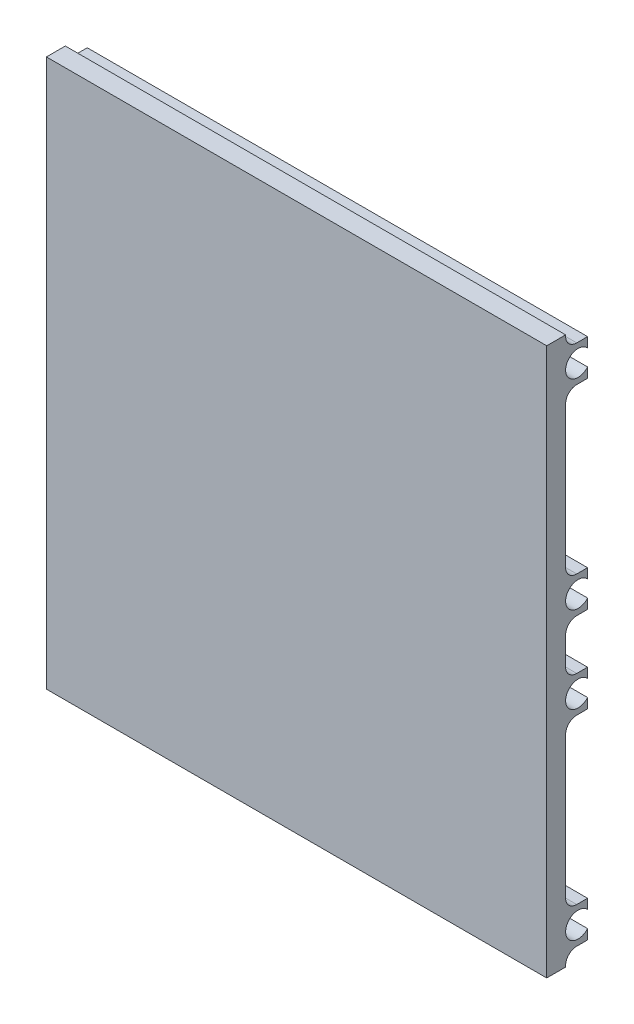
ISO-10303-21;
HEADER;
FILE_DESCRIPTION(('STEP AP214'),'2;1');
FILE_NAME('part.step','',(''),(''),'','','');
FILE_SCHEMA(('AUTOMOTIVE_DESIGN { 1 0 10303 214 1 1 1 1 }'));
ENDSEC;
DATA;
#1=APPLICATION_CONTEXT('core data for automotive mechanical design processes');
#2=APPLICATION_PROTOCOL_DEFINITION('international standard','automotive_design',2000,#1);
#3=PRODUCT_CONTEXT('',#1,'mechanical');
#4=PRODUCT('Part','Part','',(#3));
#5=PRODUCT_RELATED_PRODUCT_CATEGORY('part','',(#4));
#6=PRODUCT_DEFINITION_FORMATION('','',#4);
#7=PRODUCT_DEFINITION_CONTEXT('part definition',#1,'design');
#8=PRODUCT_DEFINITION('design','',#6,#7);
#9=PRODUCT_DEFINITION_SHAPE('','',#8);
#10=(LENGTH_UNIT() NAMED_UNIT(*) SI_UNIT(.MILLI.,.METRE.));
#11=(NAMED_UNIT(*) PLANE_ANGLE_UNIT() SI_UNIT($,.RADIAN.));
#12=(NAMED_UNIT(*) SI_UNIT($,.STERADIAN.) SOLID_ANGLE_UNIT());
#13=UNCERTAINTY_MEASURE_WITH_UNIT(LENGTH_MEASURE(1.E-05),#10,'distance_accuracy_value','');
#14=(GEOMETRIC_REPRESENTATION_CONTEXT(3) GLOBAL_UNCERTAINTY_ASSIGNED_CONTEXT((#13)) GLOBAL_UNIT_ASSIGNED_CONTEXT((#10,
#11,#12)) REPRESENTATION_CONTEXT('',''));
#15=CARTESIAN_POINT('',(0.,0.,0.));
#16=DIRECTION('',(0.,0.,1.));
#17=DIRECTION('',(1.,0.,0.));
#18=AXIS2_PLACEMENT_3D('',#15,#16,#17);
#19=CARTESIAN_POINT('',(90.,226.75,-13.));
#20=DIRECTION('',(1.,0.,0.));
#21=DIRECTION('',(0.,0.,-1.));
#22=AXIS2_PLACEMENT_3D('',#19,#20,#21);
#23=CYLINDRICAL_SURFACE('',#22,2.);
#24=DIRECTION('',(-1.,0.,0.));
#25=VECTOR('',#24,1.);
#26=CARTESIAN_POINT('',(90.,228.75,-13.));
#27=LINE('',#26,#25);
#28=CARTESIAN_POINT('',(90.,228.75,-13.));
#29=VERTEX_POINT('',#28);
#30=CARTESIAN_POINT('',(0.,228.75,-13.));
#31=VERTEX_POINT('',#30);
#32=EDGE_CURVE('E513',#29,#31,#27,.T.);
#33=ORIENTED_EDGE('',*,*,#32,.F.);
#34=CARTESIAN_POINT('',(90.,226.75,-13.));
#35=DIRECTION('',(1.,0.,0.));
#36=DIRECTION('',(0.,0.,-1.));
#37=AXIS2_PLACEMENT_3D('',#34,#35,#36);
#38=CIRCLE('',#37,2.);
#39=CARTESIAN_POINT('',(90.,226.75,-11.));
#40=VERTEX_POINT('',#39);
#41=EDGE_CURVE('E40',#29,#40,#38,.T.);
#42=ORIENTED_EDGE('',*,*,#41,.T.);
#43=DIRECTION('',(-1.,0.,0.));
#44=VECTOR('',#43,1.);
#45=CARTESIAN_POINT('',(90.,226.75,-11.));
#46=LINE('',#45,#44);
#47=CARTESIAN_POINT('',(0.,226.75,-11.));
#48=VERTEX_POINT('',#47);
#49=EDGE_CURVE('E516',#48,#40,#46,.F.);
#50=ORIENTED_EDGE('',*,*,#49,.F.);
#51=CARTESIAN_POINT('',(0.,226.75,-13.));
#52=DIRECTION('',(1.,0.,0.));
#53=DIRECTION('',(0.,0.,-1.));
#54=AXIS2_PLACEMENT_3D('',#51,#52,#53);
#55=CIRCLE('',#54,2.);
#56=EDGE_CURVE('E11',#48,#31,#55,.F.);
#57=ORIENTED_EDGE('',*,*,#56,.T.);
#58=EDGE_LOOP('',(#33,#42,#50,#57));
#59=FACE_BOUND('',#58,.T.);
#60=ADVANCED_FACE('F33',(#59),#23,.F.);
#61=CARTESIAN_POINT('',(90.,237.25,-13.));
#62=DIRECTION('',(-1.,0.,0.));
#63=DIRECTION('',(0.,0.,1.));
#64=AXIS2_PLACEMENT_3D('',#61,#62,#63);
#65=CYLINDRICAL_SURFACE('',#64,2.);
#66=DIRECTION('',(1.,0.,0.));
#67=VECTOR('',#66,1.);
#68=CARTESIAN_POINT('',(90.,235.25,-13.));
#69=LINE('',#68,#67);
#70=CARTESIAN_POINT('',(0.,235.25,-13.));
#71=VERTEX_POINT('',#70);
#72=CARTESIAN_POINT('',(90.,235.25,-13.));
#73=VERTEX_POINT('',#72);
#74=EDGE_CURVE('E503',#71,#73,#69,.T.);
#75=ORIENTED_EDGE('',*,*,#74,.F.);
#76=CARTESIAN_POINT('',(0.,237.25,-13.));
#77=DIRECTION('',(1.,0.,0.));
#78=DIRECTION('',(0.,0.,-1.));
#79=AXIS2_PLACEMENT_3D('',#76,#77,#78);
#80=CIRCLE('',#79,2.);
#81=CARTESIAN_POINT('',(0.,237.25,-11.));
#82=VERTEX_POINT('',#81);
#83=EDGE_CURVE('E509',#71,#82,#80,.F.);
#84=ORIENTED_EDGE('',*,*,#83,.T.);
#85=DIRECTION('',(1.,0.,0.));
#86=VECTOR('',#85,1.);
#87=CARTESIAN_POINT('',(90.,237.25,-11.));
#88=LINE('',#87,#86);
#89=CARTESIAN_POINT('',(90.,237.25,-11.));
#90=VERTEX_POINT('',#89);
#91=EDGE_CURVE('E506',#90,#82,#88,.F.);
#92=ORIENTED_EDGE('',*,*,#91,.F.);
#93=CARTESIAN_POINT('',(90.,237.25,-13.));
#94=DIRECTION('',(1.,0.,0.));
#95=DIRECTION('',(0.,0.,-1.));
#96=AXIS2_PLACEMENT_3D('',#93,#94,#95);
#97=CIRCLE('',#96,2.);
#98=EDGE_CURVE('E511',#90,#73,#97,.T.);
#99=ORIENTED_EDGE('',*,*,#98,.T.);
#100=EDGE_LOOP('',(#75,#84,#92,#99));
#101=FACE_BOUND('',#100,.T.);
#102=ADVANCED_FACE('F615',(#101),#65,.F.);
#103=CARTESIAN_POINT('',(90.,262.75,-13.));
#104=DIRECTION('',(1.,0.,0.));
#105=DIRECTION('',(0.,0.,-1.));
#106=AXIS2_PLACEMENT_3D('',#103,#104,#105);
#107=CYLINDRICAL_SURFACE('',#106,2.);
#108=DIRECTION('',(-1.,0.,0.));
#109=VECTOR('',#108,1.);
#110=CARTESIAN_POINT('',(90.,264.75,-13.));
#111=LINE('',#110,#109);
#112=CARTESIAN_POINT('',(90.,264.75,-13.));
#113=VERTEX_POINT('',#112);
#114=CARTESIAN_POINT('',(0.,264.75,-13.));
#115=VERTEX_POINT('',#114);
#116=EDGE_CURVE('E492',#113,#115,#111,.T.);
#117=ORIENTED_EDGE('',*,*,#116,.F.);
#118=CARTESIAN_POINT('',(90.,262.75,-13.));
#119=DIRECTION('',(1.,0.,0.));
#120=DIRECTION('',(0.,0.,-1.));
#121=AXIS2_PLACEMENT_3D('',#118,#119,#120);
#122=CIRCLE('',#121,2.);
#123=CARTESIAN_POINT('',(90.,262.75,-11.));
#124=VERTEX_POINT('',#123);
#125=EDGE_CURVE('E498',#113,#124,#122,.T.);
#126=ORIENTED_EDGE('',*,*,#125,.T.);
#127=DIRECTION('',(-1.,0.,0.));
#128=VECTOR('',#127,1.);
#129=CARTESIAN_POINT('',(90.,262.75,-11.));
#130=LINE('',#129,#128);
#131=CARTESIAN_POINT('',(0.,262.75,-11.));
#132=VERTEX_POINT('',#131);
#133=EDGE_CURVE('E495',#132,#124,#130,.F.);
#134=ORIENTED_EDGE('',*,*,#133,.F.);
#135=CARTESIAN_POINT('',(0.,262.75,-13.));
#136=DIRECTION('',(1.,0.,0.));
#137=DIRECTION('',(0.,0.,-1.));
#138=AXIS2_PLACEMENT_3D('',#135,#136,#137);
#139=CIRCLE('',#138,2.);
#140=EDGE_CURVE('E501',#132,#115,#139,.F.);
#141=ORIENTED_EDGE('',*,*,#140,.T.);
#142=EDGE_LOOP('',(#117,#126,#134,#141));
#143=FACE_BOUND('',#142,.T.);
#144=ADVANCED_FACE('F606',(#143),#107,.F.);
#145=CARTESIAN_POINT('',(90.,273.25,-13.));
#146=DIRECTION('',(1.,0.,0.));
#147=DIRECTION('',(0.,0.,-1.));
#148=AXIS2_PLACEMENT_3D('',#145,#146,#147);
#149=CYLINDRICAL_SURFACE('',#148,2.);
#150=DIRECTION('',(-1.,0.,0.));
#151=VECTOR('',#150,1.);
#152=CARTESIAN_POINT('',(90.,273.25,-11.));
#153=LINE('',#152,#151);
#154=CARTESIAN_POINT('',(90.,273.25,-11.));
#155=VERTEX_POINT('',#154);
#156=CARTESIAN_POINT('',(0.,273.25,-11.));
#157=VERTEX_POINT('',#156);
#158=EDGE_CURVE('E482',#155,#157,#153,.T.);
#159=ORIENTED_EDGE('',*,*,#158,.F.);
#160=CARTESIAN_POINT('',(90.,273.25,-13.));
#161=DIRECTION('',(1.,0.,0.));
#162=DIRECTION('',(0.,0.,-1.));
#163=AXIS2_PLACEMENT_3D('',#160,#161,#162);
#164=CIRCLE('',#163,2.);
#165=CARTESIAN_POINT('',(90.,271.25,-13.));
#166=VERTEX_POINT('',#165);
#167=EDGE_CURVE('E488',#155,#166,#164,.T.);
#168=ORIENTED_EDGE('',*,*,#167,.T.);
#169=DIRECTION('',(-1.,0.,0.));
#170=VECTOR('',#169,1.);
#171=CARTESIAN_POINT('',(90.,271.25,-13.));
#172=LINE('',#171,#170);
#173=CARTESIAN_POINT('',(0.,271.25,-13.));
#174=VERTEX_POINT('',#173);
#175=EDGE_CURVE('E485',#174,#166,#172,.F.);
#176=ORIENTED_EDGE('',*,*,#175,.F.);
#177=CARTESIAN_POINT('',(0.,273.25,-13.));
#178=DIRECTION('',(1.,0.,0.));
#179=DIRECTION('',(0.,0.,-1.));
#180=AXIS2_PLACEMENT_3D('',#177,#178,#179);
#181=CIRCLE('',#180,2.);
#182=EDGE_CURVE('E490',#174,#157,#181,.F.);
#183=ORIENTED_EDGE('',*,*,#182,.T.);
#184=EDGE_LOOP('',(#159,#168,#176,#183));
#185=FACE_BOUND('',#184,.T.);
#186=ADVANCED_FACE('F600',(#185),#149,.F.);
#187=CARTESIAN_POINT('',(90.,278.25,-13.));
#188=DIRECTION('',(-1.,0.,0.));
#189=DIRECTION('',(0.,0.,1.));
#190=AXIS2_PLACEMENT_3D('',#187,#188,#189);
#191=CYLINDRICAL_SURFACE('',#190,2.);
#192=DIRECTION('',(1.,0.,0.));
#193=VECTOR('',#192,1.);
#194=CARTESIAN_POINT('',(90.,278.25,-11.));
#195=LINE('',#194,#193);
#196=CARTESIAN_POINT('',(0.,278.25,-11.));
#197=VERTEX_POINT('',#196);
#198=CARTESIAN_POINT('',(90.,278.25,-11.));
#199=VERTEX_POINT('',#198);
#200=EDGE_CURVE('E471',#197,#199,#195,.T.);
#201=ORIENTED_EDGE('',*,*,#200,.F.);
#202=CARTESIAN_POINT('',(0.,278.25,-13.));
#203=DIRECTION('',(1.,0.,0.));
#204=DIRECTION('',(0.,0.,-1.));
#205=AXIS2_PLACEMENT_3D('',#202,#203,#204);
#206=CIRCLE('',#205,2.);
#207=CARTESIAN_POINT('',(0.,280.25,-13.));
#208=VERTEX_POINT('',#207);
#209=EDGE_CURVE('E477',#197,#208,#206,.F.);
#210=ORIENTED_EDGE('',*,*,#209,.T.);
#211=DIRECTION('',(1.,0.,0.));
#212=VECTOR('',#211,1.);
#213=CARTESIAN_POINT('',(90.,280.25,-13.));
#214=LINE('',#213,#212);
#215=CARTESIAN_POINT('',(90.,280.25,-13.));
#216=VERTEX_POINT('',#215);
#217=EDGE_CURVE('E474',#216,#208,#214,.F.);
#218=ORIENTED_EDGE('',*,*,#217,.F.);
#219=CARTESIAN_POINT('',(90.,278.25,-13.));
#220=DIRECTION('',(1.,0.,0.));
#221=DIRECTION('',(0.,0.,-1.));
#222=AXIS2_PLACEMENT_3D('',#219,#220,#221);
#223=CIRCLE('',#222,2.);
#224=EDGE_CURVE('E479',#216,#199,#223,.T.);
#225=ORIENTED_EDGE('',*,*,#224,.T.);
#226=EDGE_LOOP('',(#201,#210,#218,#225));
#227=FACE_BOUND('',#226,.T.);
#228=ADVANCED_FACE('F641',(#227),#191,.F.);
#229=CARTESIAN_POINT('',(90.,288.75,-13.));
#230=DIRECTION('',(1.,0.,0.));
#231=DIRECTION('',(0.,0.,-1.));
#232=AXIS2_PLACEMENT_3D('',#229,#230,#231);
#233=CYLINDRICAL_SURFACE('',#232,2.);
#234=DIRECTION('',(-1.,0.,0.));
#235=VECTOR('',#234,1.);
#236=CARTESIAN_POINT('',(90.,288.75,-11.));
#237=LINE('',#236,#235);
#238=CARTESIAN_POINT('',(90.,288.75,-11.));
#239=VERTEX_POINT('',#238);
#240=CARTESIAN_POINT('',(0.,288.75,-11.));
#241=VERTEX_POINT('',#240);
#242=EDGE_CURVE('E461',#239,#241,#237,.T.);
#243=ORIENTED_EDGE('',*,*,#242,.F.);
#244=CARTESIAN_POINT('',(90.,288.75,-13.));
#245=DIRECTION('',(1.,0.,0.));
#246=DIRECTION('',(0.,0.,-1.));
#247=AXIS2_PLACEMENT_3D('',#244,#245,#246);
#248=CIRCLE('',#247,2.);
#249=CARTESIAN_POINT('',(90.,286.75,-13.));
#250=VERTEX_POINT('',#249);
#251=EDGE_CURVE('E467',#239,#250,#248,.T.);
#252=ORIENTED_EDGE('',*,*,#251,.T.);
#253=DIRECTION('',(-1.,0.,0.));
#254=VECTOR('',#253,1.);
#255=CARTESIAN_POINT('',(90.,286.75,-13.));
#256=LINE('',#255,#254);
#257=CARTESIAN_POINT('',(0.,286.75,-13.));
#258=VERTEX_POINT('',#257);
#259=EDGE_CURVE('E464',#258,#250,#256,.F.);
#260=ORIENTED_EDGE('',*,*,#259,.F.);
#261=CARTESIAN_POINT('',(0.,288.75,-13.));
#262=DIRECTION('',(1.,0.,0.));
#263=DIRECTION('',(0.,0.,-1.));
#264=AXIS2_PLACEMENT_3D('',#261,#262,#263);
#265=CIRCLE('',#264,2.);
#266=EDGE_CURVE('E469',#258,#241,#265,.F.);
#267=ORIENTED_EDGE('',*,*,#266,.T.);
#268=EDGE_LOOP('',(#243,#252,#260,#267));
#269=FACE_BOUND('',#268,.T.);
#270=ADVANCED_FACE('F644',(#269),#233,.F.);
#271=CARTESIAN_POINT('',(90.,314.25,-13.));
#272=DIRECTION('',(1.,0.,0.));
#273=DIRECTION('',(0.,0.,-1.));
#274=AXIS2_PLACEMENT_3D('',#271,#272,#273);
#275=CYLINDRICAL_SURFACE('',#274,2.);
#276=DIRECTION('',(-1.,0.,0.));
#277=VECTOR('',#276,1.);
#278=CARTESIAN_POINT('',(90.,316.25,-13.));
#279=LINE('',#278,#277);
#280=CARTESIAN_POINT('',(90.,316.25,-13.));
#281=VERTEX_POINT('',#280);
#282=CARTESIAN_POINT('',(0.,316.25,-13.));
#283=VERTEX_POINT('',#282);
#284=EDGE_CURVE('E450',#281,#283,#279,.T.);
#285=ORIENTED_EDGE('',*,*,#284,.F.);
#286=CARTESIAN_POINT('',(90.,314.25,-13.));
#287=DIRECTION('',(1.,0.,0.));
#288=DIRECTION('',(0.,0.,-1.));
#289=AXIS2_PLACEMENT_3D('',#286,#287,#288);
#290=CIRCLE('',#289,2.);
#291=CARTESIAN_POINT('',(90.,314.25,-11.));
#292=VERTEX_POINT('',#291);
#293=EDGE_CURVE('E456',#281,#292,#290,.T.);
#294=ORIENTED_EDGE('',*,*,#293,.T.);
#295=DIRECTION('',(-1.,0.,0.));
#296=VECTOR('',#295,1.);
#297=CARTESIAN_POINT('',(90.,314.25,-11.));
#298=LINE('',#297,#296);
#299=CARTESIAN_POINT('',(0.,314.25,-11.));
#300=VERTEX_POINT('',#299);
#301=EDGE_CURVE('E453',#300,#292,#298,.F.);
#302=ORIENTED_EDGE('',*,*,#301,.F.);
#303=CARTESIAN_POINT('',(0.,314.25,-13.));
#304=DIRECTION('',(1.,0.,0.));
#305=DIRECTION('',(0.,0.,-1.));
#306=AXIS2_PLACEMENT_3D('',#303,#304,#305);
#307=CIRCLE('',#306,2.);
#308=EDGE_CURVE('E459',#300,#283,#307,.F.);
#309=ORIENTED_EDGE('',*,*,#308,.T.);
#310=EDGE_LOOP('',(#285,#294,#302,#309));
#311=FACE_BOUND('',#310,.T.);
#312=ADVANCED_FACE('F648',(#311),#275,.F.);
#313=CARTESIAN_POINT('',(90.,324.75,-13.));
#314=DIRECTION('',(1.,0.,0.));
#315=DIRECTION('',(0.,0.,-1.));
#316=AXIS2_PLACEMENT_3D('',#313,#314,#315);
#317=CYLINDRICAL_SURFACE('',#316,2.);
#318=DIRECTION('',(-1.,0.,0.));
#319=VECTOR('',#318,1.);
#320=CARTESIAN_POINT('',(90.,324.75,-11.));
#321=LINE('',#320,#319);
#322=CARTESIAN_POINT('',(90.,324.75,-11.));
#323=VERTEX_POINT('',#322);
#324=CARTESIAN_POINT('',(0.,324.75,-11.));
#325=VERTEX_POINT('',#324);
#326=EDGE_CURVE('E440',#323,#325,#321,.T.);
#327=ORIENTED_EDGE('',*,*,#326,.F.);
#328=CARTESIAN_POINT('',(90.,324.75,-13.));
#329=DIRECTION('',(1.,0.,0.));
#330=DIRECTION('',(0.,0.,-1.));
#331=AXIS2_PLACEMENT_3D('',#328,#329,#330);
#332=CIRCLE('',#331,2.);
#333=CARTESIAN_POINT('',(90.,322.75,-13.));
#334=VERTEX_POINT('',#333);
#335=EDGE_CURVE('E446',#323,#334,#332,.T.);
#336=ORIENTED_EDGE('',*,*,#335,.T.);
#337=DIRECTION('',(-1.,0.,0.));
#338=VECTOR('',#337,1.);
#339=CARTESIAN_POINT('',(90.,322.75,-13.));
#340=LINE('',#339,#338);
#341=CARTESIAN_POINT('',(0.,322.75,-13.));
#342=VERTEX_POINT('',#341);
#343=EDGE_CURVE('E443',#342,#334,#340,.F.);
#344=ORIENTED_EDGE('',*,*,#343,.F.);
#345=CARTESIAN_POINT('',(0.,324.75,-13.));
#346=DIRECTION('',(1.,0.,0.));
#347=DIRECTION('',(0.,0.,-1.));
#348=AXIS2_PLACEMENT_3D('',#345,#346,#347);
#349=CIRCLE('',#348,2.);
#350=EDGE_CURVE('E448',#342,#325,#349,.F.);
#351=ORIENTED_EDGE('',*,*,#350,.T.);
#352=EDGE_LOOP('',(#327,#336,#344,#351));
#353=FACE_BOUND('',#352,.T.);
#354=ADVANCED_FACE('F652',(#353),#317,.F.);
#355=CARTESIAN_POINT('',(90.,224.250000000007,-5.50000000000004));
#356=DIRECTION('',(1.,0.,0.));
#357=DIRECTION('',(0.,0.,-1.));
#358=AXIS2_PLACEMENT_3D('',#355,#356,#357);
#359=PLANE('',#358);
#360=DIRECTION('',(0.,0.,1.));
#361=VECTOR('',#360,1.);
#362=CARTESIAN_POINT('',(90.,325.,-11.));
#363=LINE('',#362,#361);
#364=CARTESIAN_POINT('',(90.,325.,-11.));
#365=VERTEX_POINT('',#364);
#366=CARTESIAN_POINT('',(90.,325.,-7.6));
#367=VERTEX_POINT('',#366);
#368=EDGE_CURVE('E280',#365,#367,#363,.T.);
#369=ORIENTED_EDGE('',*,*,#368,.T.);
#370=DIRECTION('',(0.,1.,0.));
#371=VECTOR('',#370,1.);
#372=CARTESIAN_POINT('',(90.,226.5,-7.6));
#373=LINE('',#372,#371);
#374=CARTESIAN_POINT('',(90.,226.5,-7.6));
#375=VERTEX_POINT('',#374);
#376=EDGE_CURVE('E277',#375,#367,#373,.T.);
#377=ORIENTED_EDGE('',*,*,#376,.F.);
#378=DIRECTION('',(0.,0.,1.));
#379=VECTOR('',#378,1.);
#380=CARTESIAN_POINT('',(90.,226.5,-14.9500000000008));
#381=LINE('',#380,#379);
#382=CARTESIAN_POINT('',(90.,226.5,-11.));
#383=VERTEX_POINT('',#382);
#384=EDGE_CURVE('E264',#383,#375,#381,.T.);
#385=ORIENTED_EDGE('',*,*,#384,.F.);
#386=DIRECTION('',(0.,1.,0.));
#387=VECTOR('',#386,1.);
#388=CARTESIAN_POINT('',(90.,226.5,-11.));
#389=LINE('',#388,#387);
#390=EDGE_CURVE('E413',#383,#40,#389,.T.);
#391=ORIENTED_EDGE('',*,*,#390,.T.);
#392=ORIENTED_EDGE('',*,*,#41,.F.);
#393=DIRECTION('',(0.,0.,-1.));
#394=VECTOR('',#393,1.);
#395=CARTESIAN_POINT('',(90.,228.75,-11.));
#396=LINE('',#395,#394);
#397=CARTESIAN_POINT('',(90.,228.75,-14.95));
#398=VERTEX_POINT('',#397);
#399=EDGE_CURVE('E415',#29,#398,#396,.T.);
#400=ORIENTED_EDGE('',*,*,#399,.T.);
#401=DIRECTION('',(0.,-1.,0.));
#402=VECTOR('',#401,1.);
#403=CARTESIAN_POINT('',(90.,226.5,-14.9500000000008));
#404=LINE('',#403,#402);
#405=CARTESIAN_POINT('',(90.,230.526059702703,-14.9500000000008));
#406=VERTEX_POINT('',#405);
#407=EDGE_CURVE('E429',#406,#398,#404,.T.);
#408=ORIENTED_EDGE('',*,*,#407,.F.);
#409=CARTESIAN_POINT('',(90.,232.,-13.25));
#410=DIRECTION('',(1.,0.,0.));
#411=DIRECTION('',(0.,0.,-1.));
#412=AXIS2_PLACEMENT_3D('',#409,#410,#411);
#413=CIRCLE('',#412,2.24999999999997);
#414=CARTESIAN_POINT('',(90.,233.473940297297,-14.9500000000008));
#415=VERTEX_POINT('',#414);
#416=EDGE_CURVE('E438',#415,#406,#413,.T.);
#417=ORIENTED_EDGE('',*,*,#416,.F.);
#418=CARTESIAN_POINT('',(90.,235.25,-14.9500000000008));
#419=VERTEX_POINT('',#418);
#420=EDGE_CURVE('E434',#419,#415,#404,.T.);
#421=ORIENTED_EDGE('',*,*,#420,.F.);
#422=DIRECTION('',(0.,0.,1.));
#423=VECTOR('',#422,1.);
#424=CARTESIAN_POINT('',(90.,235.25,-14.95));
#425=LINE('',#424,#423);
#426=EDGE_CURVE('E393',#419,#73,#425,.T.);
#427=ORIENTED_EDGE('',*,*,#426,.T.);
#428=ORIENTED_EDGE('',*,*,#98,.F.);
#429=DIRECTION('',(0.,1.,0.));
#430=VECTOR('',#429,1.);
#431=CARTESIAN_POINT('',(90.,235.25,-11.));
#432=LINE('',#431,#430);
#433=EDGE_CURVE('E396',#90,#124,#432,.T.);
#434=ORIENTED_EDGE('',*,*,#433,.T.);
#435=ORIENTED_EDGE('',*,*,#125,.F.);
#436=DIRECTION('',(0.,0.,-1.));
#437=VECTOR('',#436,1.);
#438=CARTESIAN_POINT('',(90.,264.75,-11.));
#439=LINE('',#438,#437);
#440=CARTESIAN_POINT('',(90.,264.75,-14.95));
#441=VERTEX_POINT('',#440);
#442=EDGE_CURVE('E399',#113,#441,#439,.T.);
#443=ORIENTED_EDGE('',*,*,#442,.T.);
#444=CARTESIAN_POINT('',(90.,266.526059702703,-14.9500000000009));
#445=VERTEX_POINT('',#444);
#446=EDGE_CURVE('E540',#445,#441,#404,.T.);
#447=ORIENTED_EDGE('',*,*,#446,.F.);
#448=CARTESIAN_POINT('',(90.,268.,-13.25));
#449=DIRECTION('',(1.,0.,0.));
#450=DIRECTION('',(0.,0.,-1.));
#451=AXIS2_PLACEMENT_3D('',#448,#449,#450);
#452=CIRCLE('',#451,2.24999999999997);
#453=CARTESIAN_POINT('',(90.,269.473940297297,-14.9500000000009));
#454=VERTEX_POINT('',#453);
#455=EDGE_CURVE('E305',#454,#445,#452,.T.);
#456=ORIENTED_EDGE('',*,*,#455,.F.);
#457=CARTESIAN_POINT('',(90.,271.25,-14.95));
#458=VERTEX_POINT('',#457);
#459=EDGE_CURVE('E541',#458,#454,#404,.T.);
#460=ORIENTED_EDGE('',*,*,#459,.F.);
#461=DIRECTION('',(0.,0.,1.));
#462=VECTOR('',#461,1.);
#463=CARTESIAN_POINT('',(90.,271.25,-14.95));
#464=LINE('',#463,#462);
#465=EDGE_CURVE('E373',#458,#166,#464,.T.);
#466=ORIENTED_EDGE('',*,*,#465,.T.);
#467=ORIENTED_EDGE('',*,*,#167,.F.);
#468=DIRECTION('',(0.,1.,0.));
#469=VECTOR('',#468,1.);
#470=CARTESIAN_POINT('',(90.,271.25,-11.));
#471=LINE('',#470,#469);
#472=EDGE_CURVE('E376',#155,#199,#471,.T.);
#473=ORIENTED_EDGE('',*,*,#472,.T.);
#474=ORIENTED_EDGE('',*,*,#224,.F.);
#475=DIRECTION('',(0.,0.,-1.));
#476=VECTOR('',#475,1.);
#477=CARTESIAN_POINT('',(90.,280.25,-11.));
#478=LINE('',#477,#476);
#479=CARTESIAN_POINT('',(90.,280.25,-14.95));
#480=VERTEX_POINT('',#479);
#481=EDGE_CURVE('E379',#216,#480,#478,.T.);
#482=ORIENTED_EDGE('',*,*,#481,.T.);
#483=CARTESIAN_POINT('',(90.,282.026059702703,-14.9500000000009));
#484=VERTEX_POINT('',#483);
#485=EDGE_CURVE('E543',#484,#480,#404,.T.);
#486=ORIENTED_EDGE('',*,*,#485,.F.);
#487=CARTESIAN_POINT('',(90.,283.5,-13.25));
#488=DIRECTION('',(-1.,0.,0.));
#489=DIRECTION('',(0.,0.,1.));
#490=AXIS2_PLACEMENT_3D('',#487,#488,#489);
#491=CIRCLE('',#490,2.24999999999997);
#492=CARTESIAN_POINT('',(90.,284.973940297297,-14.9500000000009));
#493=VERTEX_POINT('',#492);
#494=EDGE_CURVE('E312',#484,#493,#491,.T.);
#495=ORIENTED_EDGE('',*,*,#494,.T.);
#496=CARTESIAN_POINT('',(90.,286.75,-14.95));
#497=VERTEX_POINT('',#496);
#498=EDGE_CURVE('E545',#497,#493,#404,.T.);
#499=ORIENTED_EDGE('',*,*,#498,.F.);
#500=DIRECTION('',(0.,0.,1.));
#501=VECTOR('',#500,1.);
#502=CARTESIAN_POINT('',(90.,286.75,-14.95));
#503=LINE('',#502,#501);
#504=EDGE_CURVE('E353',#497,#250,#503,.T.);
#505=ORIENTED_EDGE('',*,*,#504,.T.);
#506=ORIENTED_EDGE('',*,*,#251,.F.);
#507=DIRECTION('',(0.,1.,0.));
#508=VECTOR('',#507,1.);
#509=CARTESIAN_POINT('',(90.,286.75,-11.));
#510=LINE('',#509,#508);
#511=EDGE_CURVE('E356',#239,#292,#510,.T.);
#512=ORIENTED_EDGE('',*,*,#511,.T.);
#513=ORIENTED_EDGE('',*,*,#293,.F.);
#514=DIRECTION('',(0.,0.,-1.));
#515=VECTOR('',#514,1.);
#516=CARTESIAN_POINT('',(90.,316.25,-11.));
#517=LINE('',#516,#515);
#518=CARTESIAN_POINT('',(90.,316.25,-14.95));
#519=VERTEX_POINT('',#518);
#520=EDGE_CURVE('E359',#281,#519,#517,.T.);
#521=ORIENTED_EDGE('',*,*,#520,.T.);
#522=CARTESIAN_POINT('',(90.,318.026059702703,-14.950000000001));
#523=VERTEX_POINT('',#522);
#524=EDGE_CURVE('E433',#523,#519,#404,.T.);
#525=ORIENTED_EDGE('',*,*,#524,.F.);
#526=CARTESIAN_POINT('',(90.,319.5,-13.25));
#527=DIRECTION('',(-1.,0.,0.));
#528=DIRECTION('',(0.,0.,1.));
#529=AXIS2_PLACEMENT_3D('',#526,#527,#528);
#530=CIRCLE('',#529,2.24999999999997);
#531=CARTESIAN_POINT('',(90.,320.973940297297,-14.950000000001));
#532=VERTEX_POINT('',#531);
#533=EDGE_CURVE('E323',#523,#532,#530,.T.);
#534=ORIENTED_EDGE('',*,*,#533,.T.);
#535=CARTESIAN_POINT('',(90.,322.75,-14.95));
#536=VERTEX_POINT('',#535);
#537=EDGE_CURVE('E274',#536,#532,#404,.T.);
#538=ORIENTED_EDGE('',*,*,#537,.F.);
#539=DIRECTION('',(0.,0.,1.));
#540=VECTOR('',#539,1.);
#541=CARTESIAN_POINT('',(90.,322.75,-14.95));
#542=LINE('',#541,#540);
#543=EDGE_CURVE('E340',#536,#334,#542,.T.);
#544=ORIENTED_EDGE('',*,*,#543,.T.);
#545=ORIENTED_EDGE('',*,*,#335,.F.);
#546=DIRECTION('',(0.,1.,0.));
#547=VECTOR('',#546,1.);
#548=CARTESIAN_POINT('',(90.,322.75,-11.));
#549=LINE('',#548,#547);
#550=EDGE_CURVE('E343',#323,#365,#549,.T.);
#551=ORIENTED_EDGE('',*,*,#550,.T.);
#552=EDGE_LOOP('',(#369,#377,#385,#391,#392,#400,#408,#417,#421,#427,#428,#434,#435,#443,#447,
#456,#460,#466,#467,#473,#474,#482,#486,#495,#499,#505,#506,#512,#513,#521,#525,#534,#538,#544,
#545,#551));
#553=FACE_BOUND('',#552,.T.);
#554=ADVANCED_FACE('F278',(#553),#359,.T.);
#555=CARTESIAN_POINT('',(0.,224.250000000007,-5.50000000000004));
#556=DIRECTION('',(1.,0.,0.));
#557=DIRECTION('',(0.,0.,-1.));
#558=AXIS2_PLACEMENT_3D('',#555,#556,#557);
#559=PLANE('',#558);
#560=DIRECTION('',(0.,0.,1.));
#561=VECTOR('',#560,1.);
#562=CARTESIAN_POINT('',(0.,226.5,-14.9500000000008));
#563=LINE('',#562,#561);
#564=CARTESIAN_POINT('',(0.,226.5,-11.));
#565=VERTEX_POINT('',#564);
#566=CARTESIAN_POINT('',(0.,226.5,-7.6));
#567=VERTEX_POINT('',#566);
#568=EDGE_CURVE('E273',#565,#567,#563,.T.);
#569=ORIENTED_EDGE('',*,*,#568,.T.);
#570=DIRECTION('',(0.,-1.,0.));
#571=VECTOR('',#570,1.);
#572=CARTESIAN_POINT('',(0.,325.,-7.6));
#573=LINE('',#572,#571);
#574=CARTESIAN_POINT('',(0.,325.,-7.6));
#575=VERTEX_POINT('',#574);
#576=EDGE_CURVE('E289',#575,#567,#573,.T.);
#577=ORIENTED_EDGE('',*,*,#576,.F.);
#578=DIRECTION('',(0.,0.,1.));
#579=VECTOR('',#578,1.);
#580=CARTESIAN_POINT('',(0.,325.,-11.));
#581=LINE('',#580,#579);
#582=CARTESIAN_POINT('',(0.,325.,-11.));
#583=VERTEX_POINT('',#582);
#584=EDGE_CURVE('E333',#583,#575,#581,.T.);
#585=ORIENTED_EDGE('',*,*,#584,.F.);
#586=DIRECTION('',(0.,1.,0.));
#587=VECTOR('',#586,1.);
#588=CARTESIAN_POINT('',(0.,322.75,-11.));
#589=LINE('',#588,#587);
#590=EDGE_CURVE('E344',#325,#583,#589,.T.);
#591=ORIENTED_EDGE('',*,*,#590,.F.);
#592=ORIENTED_EDGE('',*,*,#350,.F.);
#593=DIRECTION('',(0.,0.,1.));
#594=VECTOR('',#593,1.);
#595=CARTESIAN_POINT('',(0.,322.75,-14.95));
#596=LINE('',#595,#594);
#597=CARTESIAN_POINT('',(0.,322.75,-14.95));
#598=VERTEX_POINT('',#597);
#599=EDGE_CURVE('E339',#598,#342,#596,.T.);
#600=ORIENTED_EDGE('',*,*,#599,.F.);
#601=DIRECTION('',(0.,1.,0.));
#602=VECTOR('',#601,1.);
#603=CARTESIAN_POINT('',(0.,328.950000000002,-14.9500000000011));
#604=LINE('',#603,#602);
#605=CARTESIAN_POINT('',(0.,320.973940297297,-14.950000000001));
#606=VERTEX_POINT('',#605);
#607=EDGE_CURVE('E424',#606,#598,#604,.T.);
#608=ORIENTED_EDGE('',*,*,#607,.F.);
#609=CARTESIAN_POINT('',(0.,319.5,-13.25));
#610=DIRECTION('',(-1.,0.,0.));
#611=DIRECTION('',(0.,0.,1.));
#612=AXIS2_PLACEMENT_3D('',#609,#610,#611);
#613=CIRCLE('',#612,2.24999999999997);
#614=CARTESIAN_POINT('',(0.,318.026059702703,-14.950000000001));
#615=VERTEX_POINT('',#614);
#616=EDGE_CURVE('E314',#615,#606,#613,.T.);
#617=ORIENTED_EDGE('',*,*,#616,.F.);
#618=CARTESIAN_POINT('',(0.,316.25,-14.95));
#619=VERTEX_POINT('',#618);
#620=EDGE_CURVE('E570',#619,#615,#604,.T.);
#621=ORIENTED_EDGE('',*,*,#620,.F.);
#622=DIRECTION('',(0.,0.,-1.));
#623=VECTOR('',#622,1.);
#624=CARTESIAN_POINT('',(0.,316.25,-11.));
#625=LINE('',#624,#623);
#626=EDGE_CURVE('E357',#283,#619,#625,.T.);
#627=ORIENTED_EDGE('',*,*,#626,.F.);
#628=ORIENTED_EDGE('',*,*,#308,.F.);
#629=DIRECTION('',(0.,1.,0.));
#630=VECTOR('',#629,1.);
#631=CARTESIAN_POINT('',(0.,286.75,-11.));
#632=LINE('',#631,#630);
#633=EDGE_CURVE('E364',#241,#300,#632,.T.);
#634=ORIENTED_EDGE('',*,*,#633,.F.);
#635=ORIENTED_EDGE('',*,*,#266,.F.);
#636=DIRECTION('',(0.,0.,1.));
#637=VECTOR('',#636,1.);
#638=CARTESIAN_POINT('',(0.,286.75,-14.95));
#639=LINE('',#638,#637);
#640=CARTESIAN_POINT('',(0.,286.75,-14.95));
#641=VERTEX_POINT('',#640);
#642=EDGE_CURVE('E352',#641,#258,#639,.T.);
#643=ORIENTED_EDGE('',*,*,#642,.F.);
#644=CARTESIAN_POINT('',(0.,284.973940297297,-14.9500000000009));
#645=VERTEX_POINT('',#644);
#646=EDGE_CURVE('E572',#645,#641,#604,.T.);
#647=ORIENTED_EDGE('',*,*,#646,.F.);
#648=CARTESIAN_POINT('',(0.,283.5,-13.25));
#649=DIRECTION('',(-1.,0.,0.));
#650=DIRECTION('',(0.,0.,1.));
#651=AXIS2_PLACEMENT_3D('',#648,#649,#650);
#652=CIRCLE('',#651,2.24999999999997);
#653=CARTESIAN_POINT('',(0.,282.026059702703,-14.9500000000009));
#654=VERTEX_POINT('',#653);
#655=EDGE_CURVE('E306',#654,#645,#652,.T.);
#656=ORIENTED_EDGE('',*,*,#655,.F.);
#657=CARTESIAN_POINT('',(0.,280.25,-14.95));
#658=VERTEX_POINT('',#657);
#659=EDGE_CURVE('E573',#658,#654,#604,.T.);
#660=ORIENTED_EDGE('',*,*,#659,.F.);
#661=DIRECTION('',(0.,0.,-1.));
#662=VECTOR('',#661,1.);
#663=CARTESIAN_POINT('',(0.,280.25,-11.));
#664=LINE('',#663,#662);
#665=EDGE_CURVE('E377',#208,#658,#664,.T.);
#666=ORIENTED_EDGE('',*,*,#665,.F.);
#667=ORIENTED_EDGE('',*,*,#209,.F.);
#668=DIRECTION('',(0.,1.,0.));
#669=VECTOR('',#668,1.);
#670=CARTESIAN_POINT('',(0.,271.25,-11.));
#671=LINE('',#670,#669);
#672=EDGE_CURVE('E384',#157,#197,#671,.T.);
#673=ORIENTED_EDGE('',*,*,#672,.F.);
#674=ORIENTED_EDGE('',*,*,#182,.F.);
#675=DIRECTION('',(0.,0.,1.));
#676=VECTOR('',#675,1.);
#677=CARTESIAN_POINT('',(0.,271.25,-14.95));
#678=LINE('',#677,#676);
#679=CARTESIAN_POINT('',(0.,271.25,-14.95));
#680=VERTEX_POINT('',#679);
#681=EDGE_CURVE('E370',#680,#174,#678,.T.);
#682=ORIENTED_EDGE('',*,*,#681,.F.);
#683=CARTESIAN_POINT('',(0.,269.473940297297,-14.9500000000009));
#684=VERTEX_POINT('',#683);
#685=EDGE_CURVE('E574',#684,#680,#604,.T.);
#686=ORIENTED_EDGE('',*,*,#685,.F.);
#687=CARTESIAN_POINT('',(0.,268.,-13.25));
#688=DIRECTION('',(-1.,0.,0.));
#689=DIRECTION('',(0.,0.,1.));
#690=AXIS2_PLACEMENT_3D('',#687,#688,#689);
#691=CIRCLE('',#690,2.24999999999997);
#692=CARTESIAN_POINT('',(0.,266.526059702703,-14.9500000000009));
#693=VERTEX_POINT('',#692);
#694=EDGE_CURVE('E303',#693,#684,#691,.T.);
#695=ORIENTED_EDGE('',*,*,#694,.F.);
#696=CARTESIAN_POINT('',(0.,264.75,-14.95));
#697=VERTEX_POINT('',#696);
#698=EDGE_CURVE('E431',#697,#693,#604,.T.);
#699=ORIENTED_EDGE('',*,*,#698,.F.);
#700=DIRECTION('',(0.,0.,-1.));
#701=VECTOR('',#700,1.);
#702=CARTESIAN_POINT('',(0.,264.75,-11.));
#703=LINE('',#702,#701);
#704=EDGE_CURVE('E397',#115,#697,#703,.T.);
#705=ORIENTED_EDGE('',*,*,#704,.F.);
#706=ORIENTED_EDGE('',*,*,#140,.F.);
#707=DIRECTION('',(0.,1.,0.));
#708=VECTOR('',#707,1.);
#709=CARTESIAN_POINT('',(0.,235.25,-11.));
#710=LINE('',#709,#708);
#711=EDGE_CURVE('E404',#82,#132,#710,.T.);
#712=ORIENTED_EDGE('',*,*,#711,.F.);
#713=ORIENTED_EDGE('',*,*,#83,.F.);
#714=DIRECTION('',(0.,0.,1.));
#715=VECTOR('',#714,1.);
#716=CARTESIAN_POINT('',(0.,235.25,-14.95));
#717=LINE('',#716,#715);
#718=CARTESIAN_POINT('',(0.,235.25,-14.95));
#719=VERTEX_POINT('',#718);
#720=EDGE_CURVE('E390',#719,#71,#717,.T.);
#721=ORIENTED_EDGE('',*,*,#720,.F.);
#722=CARTESIAN_POINT('',(0.,233.473940297297,-14.9500000000008));
#723=VERTEX_POINT('',#722);
#724=EDGE_CURVE('E430',#723,#719,#604,.T.);
#725=ORIENTED_EDGE('',*,*,#724,.F.);
#726=CARTESIAN_POINT('',(0.,232.,-13.25));
#727=DIRECTION('',(-1.,0.,0.));
#728=DIRECTION('',(0.,0.,1.));
#729=AXIS2_PLACEMENT_3D('',#726,#727,#728);
#730=CIRCLE('',#729,2.24999999999997);
#731=CARTESIAN_POINT('',(0.,230.526059702703,-14.9500000000008));
#732=VERTEX_POINT('',#731);
#733=EDGE_CURVE('E294',#732,#723,#730,.T.);
#734=ORIENTED_EDGE('',*,*,#733,.F.);
#735=CARTESIAN_POINT('',(0.,228.75,-14.9500000000008));
#736=VERTEX_POINT('',#735);
#737=EDGE_CURVE('E426',#736,#732,#604,.T.);
#738=ORIENTED_EDGE('',*,*,#737,.F.);
#739=DIRECTION('',(0.,0.,-1.));
#740=VECTOR('',#739,1.);
#741=CARTESIAN_POINT('',(0.,228.75,-11.));
#742=LINE('',#741,#740);
#743=EDGE_CURVE('E416',#31,#736,#742,.T.);
#744=ORIENTED_EDGE('',*,*,#743,.F.);
#745=ORIENTED_EDGE('',*,*,#56,.F.);
#746=DIRECTION('',(0.,1.,0.));
#747=VECTOR('',#746,1.);
#748=CARTESIAN_POINT('',(0.,226.5,-11.));
#749=LINE('',#748,#747);
#750=EDGE_CURVE('E410',#565,#48,#749,.T.);
#751=ORIENTED_EDGE('',*,*,#750,.F.);
#752=EDGE_LOOP('',(#569,#577,#585,#591,#592,#600,#608,#617,#621,#627,#628,#634,#635,#643,#647,
#656,#660,#666,#667,#673,#674,#682,#686,#695,#699,#705,#706,#712,#713,#721,#725,#734,#738,#744,
#745,#751));
#753=FACE_BOUND('',#752,.T.);
#754=ADVANCED_FACE('F529',(#753),#559,.F.);
#755=CARTESIAN_POINT('',(0.,0.,-14.9500000000001));
#756=DIRECTION('',(0.,0.,1.));
#757=DIRECTION('',(0.,-1.,0.));
#758=AXIS2_PLACEMENT_3D('',#755,#756,#757);
#759=PLANE('',#758);
#760=ORIENTED_EDGE('',*,*,#420,.T.);
#761=DIRECTION('',(-1.,0.,0.));
#762=VECTOR('',#761,1.);
#763=CARTESIAN_POINT('',(0.,233.473940297297,-14.9500000000008));
#764=LINE('',#763,#762);
#765=EDGE_CURVE('E299',#415,#723,#764,.T.);
#766=ORIENTED_EDGE('',*,*,#765,.T.);
#767=ORIENTED_EDGE('',*,*,#724,.T.);
#768=DIRECTION('',(-1.,0.,0.));
#769=VECTOR('',#768,1.);
#770=CARTESIAN_POINT('',(90.,235.25,-14.95));
#771=LINE('',#770,#769);
#772=EDGE_CURVE('E401',#419,#719,#771,.T.);
#773=ORIENTED_EDGE('',*,*,#772,.F.);
#774=EDGE_LOOP('',(#760,#766,#767,#773));
#775=FACE_BOUND('',#774,.T.);
#776=ADVANCED_FACE('F537',(#775),#759,.F.);
#777=ORIENTED_EDGE('',*,*,#459,.T.);
#778=DIRECTION('',(-1.,0.,0.));
#779=VECTOR('',#778,1.);
#780=CARTESIAN_POINT('',(0.,269.473940297297,-14.9500000000009));
#781=LINE('',#780,#779);
#782=EDGE_CURVE('E309',#454,#684,#781,.T.);
#783=ORIENTED_EDGE('',*,*,#782,.T.);
#784=ORIENTED_EDGE('',*,*,#685,.T.);
#785=DIRECTION('',(-1.,0.,0.));
#786=VECTOR('',#785,1.);
#787=CARTESIAN_POINT('',(90.,271.25,-14.95));
#788=LINE('',#787,#786);
#789=EDGE_CURVE('E381',#458,#680,#788,.T.);
#790=ORIENTED_EDGE('',*,*,#789,.F.);
#791=EDGE_LOOP('',(#777,#783,#784,#790));
#792=FACE_BOUND('',#791,.T.);
#793=ADVANCED_FACE('F592',(#792),#759,.F.);
#794=ORIENTED_EDGE('',*,*,#498,.T.);
#795=DIRECTION('',(-1.,0.,0.));
#796=VECTOR('',#795,1.);
#797=CARTESIAN_POINT('',(0.,284.973940297297,-14.9500000000009));
#798=LINE('',#797,#796);
#799=EDGE_CURVE('E320',#493,#645,#798,.T.);
#800=ORIENTED_EDGE('',*,*,#799,.T.);
#801=ORIENTED_EDGE('',*,*,#646,.T.);
#802=DIRECTION('',(-1.,0.,0.));
#803=VECTOR('',#802,1.);
#804=CARTESIAN_POINT('',(90.,286.75,-14.95));
#805=LINE('',#804,#803);
#806=EDGE_CURVE('E361',#497,#641,#805,.T.);
#807=ORIENTED_EDGE('',*,*,#806,.F.);
#808=EDGE_LOOP('',(#794,#800,#801,#807));
#809=FACE_BOUND('',#808,.T.);
#810=ADVANCED_FACE('F861',(#809),#759,.F.);
#811=ORIENTED_EDGE('',*,*,#537,.T.);
#812=DIRECTION('',(-1.,0.,0.));
#813=VECTOR('',#812,1.);
#814=CARTESIAN_POINT('',(0.,320.973940297297,-14.9500000000011));
#815=LINE('',#814,#813);
#816=EDGE_CURVE('E330',#532,#606,#815,.T.);
#817=ORIENTED_EDGE('',*,*,#816,.T.);
#818=ORIENTED_EDGE('',*,*,#607,.T.);
#819=DIRECTION('',(-1.,0.,0.));
#820=VECTOR('',#819,1.);
#821=CARTESIAN_POINT('',(90.,322.75,-14.95));
#822=LINE('',#821,#820);
#823=EDGE_CURVE('E346',#536,#598,#822,.T.);
#824=ORIENTED_EDGE('',*,*,#823,.F.);
#825=EDGE_LOOP('',(#811,#817,#818,#824));
#826=FACE_BOUND('',#825,.T.);
#827=ADVANCED_FACE('F867',(#826),#759,.F.);
#828=ORIENTED_EDGE('',*,*,#620,.T.);
#829=DIRECTION('',(-1.,0.,0.));
#830=VECTOR('',#829,1.);
#831=CARTESIAN_POINT('',(0.,318.026059702703,-14.950000000001));
#832=LINE('',#831,#830);
#833=EDGE_CURVE('E327',#615,#523,#832,.F.);
#834=ORIENTED_EDGE('',*,*,#833,.T.);
#835=ORIENTED_EDGE('',*,*,#524,.T.);
#836=DIRECTION('',(-1.,0.,0.));
#837=VECTOR('',#836,1.);
#838=CARTESIAN_POINT('',(90.,316.25,-14.95));
#839=LINE('',#838,#837);
#840=EDGE_CURVE('E367',#519,#619,#839,.T.);
#841=ORIENTED_EDGE('',*,*,#840,.T.);
#842=EDGE_LOOP('',(#828,#834,#835,#841));
#843=FACE_BOUND('',#842,.T.);
#844=ADVANCED_FACE('F559',(#843),#759,.F.);
#845=ORIENTED_EDGE('',*,*,#659,.T.);
#846=DIRECTION('',(-1.,0.,0.));
#847=VECTOR('',#846,1.);
#848=CARTESIAN_POINT('',(0.,282.026059702703,-14.9500000000009));
#849=LINE('',#848,#847);
#850=EDGE_CURVE('E317',#654,#484,#849,.F.);
#851=ORIENTED_EDGE('',*,*,#850,.T.);
#852=ORIENTED_EDGE('',*,*,#485,.T.);
#853=DIRECTION('',(-1.,0.,0.));
#854=VECTOR('',#853,1.);
#855=CARTESIAN_POINT('',(90.,280.25,-14.95));
#856=LINE('',#855,#854);
#857=EDGE_CURVE('E387',#480,#658,#856,.T.);
#858=ORIENTED_EDGE('',*,*,#857,.T.);
#859=EDGE_LOOP('',(#845,#851,#852,#858));
#860=FACE_BOUND('',#859,.T.);
#861=ADVANCED_FACE('F878',(#860),#759,.F.);
#862=ORIENTED_EDGE('',*,*,#698,.T.);
#863=DIRECTION('',(-1.,0.,0.));
#864=VECTOR('',#863,1.);
#865=CARTESIAN_POINT('',(0.,266.526059702703,-14.9500000000009));
#866=LINE('',#865,#864);
#867=EDGE_CURVE('E302',#693,#445,#866,.F.);
#868=ORIENTED_EDGE('',*,*,#867,.T.);
#869=ORIENTED_EDGE('',*,*,#446,.T.);
#870=DIRECTION('',(-1.,0.,0.));
#871=VECTOR('',#870,1.);
#872=CARTESIAN_POINT('',(90.,264.75,-14.95));
#873=LINE('',#872,#871);
#874=EDGE_CURVE('E407',#441,#697,#873,.T.);
#875=ORIENTED_EDGE('',*,*,#874,.T.);
#876=EDGE_LOOP('',(#862,#868,#869,#875));
#877=FACE_BOUND('',#876,.T.);
#878=ADVANCED_FACE('F581',(#877),#759,.F.);
#879=CARTESIAN_POINT('',(0.,226.5,-14.9500000000008));
#880=DIRECTION('',(0.,1.,0.));
#881=DIRECTION('',(0.,0.,1.));
#882=AXIS2_PLACEMENT_3D('',#879,#880,#881);
#883=PLANE('',#882);
#884=ORIENTED_EDGE('',*,*,#384,.T.);
#885=DIRECTION('',(1.,0.,0.));
#886=VECTOR('',#885,1.);
#887=CARTESIAN_POINT('',(0.,226.5,-7.6));
#888=LINE('',#887,#886);
#889=EDGE_CURVE('E269',#567,#375,#888,.T.);
#890=ORIENTED_EDGE('',*,*,#889,.F.);
#891=ORIENTED_EDGE('',*,*,#568,.F.);
#892=DIRECTION('',(-1.,0.,0.));
#893=VECTOR('',#892,1.);
#894=CARTESIAN_POINT('',(90.,226.5,-11.));
#895=LINE('',#894,#893);
#896=EDGE_CURVE('E270',#383,#565,#895,.T.);
#897=ORIENTED_EDGE('',*,*,#896,.F.);
#898=EDGE_LOOP('',(#884,#890,#891,#897));
#899=FACE_BOUND('',#898,.T.);
#900=ADVANCED_FACE('F266',(#899),#883,.F.);
#901=ORIENTED_EDGE('',*,*,#737,.T.);
#902=DIRECTION('',(-1.,0.,0.));
#903=VECTOR('',#902,1.);
#904=CARTESIAN_POINT('',(0.,230.526059702703,-14.9500000000008));
#905=LINE('',#904,#903);
#906=EDGE_CURVE('E296',#732,#406,#905,.F.);
#907=ORIENTED_EDGE('',*,*,#906,.T.);
#908=ORIENTED_EDGE('',*,*,#407,.T.);
#909=DIRECTION('',(-1.,0.,0.));
#910=VECTOR('',#909,1.);
#911=CARTESIAN_POINT('',(90.,228.75,-14.95));
#912=LINE('',#911,#910);
#913=EDGE_CURVE('E421',#398,#736,#912,.T.);
#914=ORIENTED_EDGE('',*,*,#913,.T.);
#915=EDGE_LOOP('',(#901,#907,#908,#914));
#916=FACE_BOUND('',#915,.T.);
#917=ADVANCED_FACE('F527',(#916),#759,.F.);
#918=CARTESIAN_POINT('',(90.,228.75,-11.));
#919=DIRECTION('',(0.,1.,0.));
#920=DIRECTION('',(0.,0.,1.));
#921=AXIS2_PLACEMENT_3D('',#918,#919,#920);
#922=PLANE('',#921);
#923=ORIENTED_EDGE('',*,*,#399,.F.);
#924=ORIENTED_EDGE('',*,*,#32,.T.);
#925=ORIENTED_EDGE('',*,*,#743,.T.);
#926=ORIENTED_EDGE('',*,*,#913,.F.);
#927=EDGE_LOOP('',(#923,#924,#925,#926));
#928=FACE_BOUND('',#927,.T.);
#929=ADVANCED_FACE('F524',(#928),#922,.F.);
#930=CARTESIAN_POINT('',(90.,226.5,-11.));
#931=DIRECTION('',(0.,0.,1.));
#932=DIRECTION('',(1.,0.,0.));
#933=AXIS2_PLACEMENT_3D('',#930,#931,#932);
#934=PLANE('',#933);
#935=ORIENTED_EDGE('',*,*,#750,.T.);
#936=ORIENTED_EDGE('',*,*,#49,.T.);
#937=ORIENTED_EDGE('',*,*,#390,.F.);
#938=ORIENTED_EDGE('',*,*,#896,.T.);
#939=EDGE_LOOP('',(#935,#936,#937,#938));
#940=FACE_BOUND('',#939,.T.);
#941=ADVANCED_FACE('F518',(#940),#934,.F.);
#942=CARTESIAN_POINT('',(90.,264.75,-11.));
#943=DIRECTION('',(0.,1.,0.));
#944=DIRECTION('',(0.,0.,1.));
#945=AXIS2_PLACEMENT_3D('',#942,#943,#944);
#946=PLANE('',#945);
#947=ORIENTED_EDGE('',*,*,#442,.F.);
#948=ORIENTED_EDGE('',*,*,#116,.T.);
#949=ORIENTED_EDGE('',*,*,#704,.T.);
#950=ORIENTED_EDGE('',*,*,#874,.F.);
#951=EDGE_LOOP('',(#947,#948,#949,#950));
#952=FACE_BOUND('',#951,.T.);
#953=ADVANCED_FACE('F603',(#952),#946,.F.);
#954=CARTESIAN_POINT('',(90.,235.25,-11.));
#955=DIRECTION('',(0.,0.,1.));
#956=DIRECTION('',(1.,0.,0.));
#957=AXIS2_PLACEMENT_3D('',#954,#955,#956);
#958=PLANE('',#957);
#959=ORIENTED_EDGE('',*,*,#433,.F.);
#960=ORIENTED_EDGE('',*,*,#91,.T.);
#961=ORIENTED_EDGE('',*,*,#711,.T.);
#962=ORIENTED_EDGE('',*,*,#133,.T.);
#963=EDGE_LOOP('',(#959,#960,#961,#962));
#964=FACE_BOUND('',#963,.T.);
#965=ADVANCED_FACE('F612',(#964),#958,.F.);
#966=CARTESIAN_POINT('',(90.,235.25,-14.95));
#967=DIRECTION('',(0.,-1.,0.));
#968=DIRECTION('',(0.,0.,-1.));
#969=AXIS2_PLACEMENT_3D('',#966,#967,#968);
#970=PLANE('',#969);
#971=ORIENTED_EDGE('',*,*,#720,.T.);
#972=ORIENTED_EDGE('',*,*,#74,.T.);
#973=ORIENTED_EDGE('',*,*,#426,.F.);
#974=ORIENTED_EDGE('',*,*,#772,.T.);
#975=EDGE_LOOP('',(#971,#972,#973,#974));
#976=FACE_BOUND('',#975,.T.);
#977=ADVANCED_FACE('F617',(#976),#970,.F.);
#978=CARTESIAN_POINT('',(90.,280.25,-11.));
#979=DIRECTION('',(0.,1.,0.));
#980=DIRECTION('',(0.,0.,1.));
#981=AXIS2_PLACEMENT_3D('',#978,#979,#980);
#982=PLANE('',#981);
#983=ORIENTED_EDGE('',*,*,#481,.F.);
#984=ORIENTED_EDGE('',*,*,#217,.T.);
#985=ORIENTED_EDGE('',*,*,#665,.T.);
#986=ORIENTED_EDGE('',*,*,#857,.F.);
#987=EDGE_LOOP('',(#983,#984,#985,#986));
#988=FACE_BOUND('',#987,.T.);
#989=ADVANCED_FACE('F619',(#988),#982,.F.);
#990=CARTESIAN_POINT('',(90.,271.25,-11.));
#991=DIRECTION('',(0.,0.,1.));
#992=DIRECTION('',(1.,0.,0.));
#993=AXIS2_PLACEMENT_3D('',#990,#991,#992);
#994=PLANE('',#993);
#995=ORIENTED_EDGE('',*,*,#472,.F.);
#996=ORIENTED_EDGE('',*,*,#158,.T.);
#997=ORIENTED_EDGE('',*,*,#672,.T.);
#998=ORIENTED_EDGE('',*,*,#200,.T.);
#999=EDGE_LOOP('',(#995,#996,#997,#998));
#1000=FACE_BOUND('',#999,.T.);
#1001=ADVANCED_FACE('F625',(#1000),#994,.F.);
#1002=CARTESIAN_POINT('',(90.,271.25,-14.95));
#1003=DIRECTION('',(0.,-1.,0.));
#1004=DIRECTION('',(0.,0.,-1.));
#1005=AXIS2_PLACEMENT_3D('',#1002,#1003,#1004);
#1006=PLANE('',#1005);
#1007=ORIENTED_EDGE('',*,*,#681,.T.);
#1008=ORIENTED_EDGE('',*,*,#175,.T.);
#1009=ORIENTED_EDGE('',*,*,#465,.F.);
#1010=ORIENTED_EDGE('',*,*,#789,.T.);
#1011=EDGE_LOOP('',(#1007,#1008,#1009,#1010));
#1012=FACE_BOUND('',#1011,.T.);
#1013=ADVANCED_FACE('F594',(#1012),#1006,.F.);
#1014=CARTESIAN_POINT('',(90.,316.25,-11.));
#1015=DIRECTION('',(0.,1.,0.));
#1016=DIRECTION('',(0.,0.,1.));
#1017=AXIS2_PLACEMENT_3D('',#1014,#1015,#1016);
#1018=PLANE('',#1017);
#1019=ORIENTED_EDGE('',*,*,#520,.F.);
#1020=ORIENTED_EDGE('',*,*,#284,.T.);
#1021=ORIENTED_EDGE('',*,*,#626,.T.);
#1022=ORIENTED_EDGE('',*,*,#840,.F.);
#1023=EDGE_LOOP('',(#1019,#1020,#1021,#1022));
#1024=FACE_BOUND('',#1023,.T.);
#1025=ADVANCED_FACE('F563',(#1024),#1018,.F.);
#1026=CARTESIAN_POINT('',(90.,286.75,-11.));
#1027=DIRECTION('',(0.,0.,1.));
#1028=DIRECTION('',(1.,0.,0.));
#1029=AXIS2_PLACEMENT_3D('',#1026,#1027,#1028);
#1030=PLANE('',#1029);
#1031=ORIENTED_EDGE('',*,*,#511,.F.);
#1032=ORIENTED_EDGE('',*,*,#242,.T.);
#1033=ORIENTED_EDGE('',*,*,#633,.T.);
#1034=ORIENTED_EDGE('',*,*,#301,.T.);
#1035=EDGE_LOOP('',(#1031,#1032,#1033,#1034));
#1036=FACE_BOUND('',#1035,.T.);
#1037=ADVANCED_FACE('F785',(#1036),#1030,.F.);
#1038=CARTESIAN_POINT('',(90.,286.75,-14.95));
#1039=DIRECTION('',(0.,-1.,0.));
#1040=DIRECTION('',(0.,0.,-1.));
#1041=AXIS2_PLACEMENT_3D('',#1038,#1039,#1040);
#1042=PLANE('',#1041);
#1043=ORIENTED_EDGE('',*,*,#642,.T.);
#1044=ORIENTED_EDGE('',*,*,#259,.T.);
#1045=ORIENTED_EDGE('',*,*,#504,.F.);
#1046=ORIENTED_EDGE('',*,*,#806,.T.);
#1047=EDGE_LOOP('',(#1043,#1044,#1045,#1046));
#1048=FACE_BOUND('',#1047,.T.);
#1049=ADVANCED_FACE('F778',(#1048),#1042,.F.);
#1050=CARTESIAN_POINT('',(90.,322.75,-11.));
#1051=DIRECTION('',(0.,0.,1.));
#1052=DIRECTION('',(0.,-1.,0.));
#1053=AXIS2_PLACEMENT_3D('',#1050,#1051,#1052);
#1054=PLANE('',#1053);
#1055=ORIENTED_EDGE('',*,*,#550,.F.);
#1056=ORIENTED_EDGE('',*,*,#326,.T.);
#1057=ORIENTED_EDGE('',*,*,#590,.T.);
#1058=DIRECTION('',(-1.,0.,0.));
#1059=VECTOR('',#1058,1.);
#1060=CARTESIAN_POINT('',(90.,325.,-11.));
#1061=LINE('',#1060,#1059);
#1062=EDGE_CURVE('E335',#365,#583,#1061,.T.);
#1063=ORIENTED_EDGE('',*,*,#1062,.F.);
#1064=EDGE_LOOP('',(#1055,#1056,#1057,#1063));
#1065=FACE_BOUND('',#1064,.T.);
#1066=ADVANCED_FACE('F775',(#1065),#1054,.F.);
#1067=CARTESIAN_POINT('',(90.,322.75,-14.95));
#1068=DIRECTION('',(0.,-1.,0.));
#1069=DIRECTION('',(0.,0.,-1.));
#1070=AXIS2_PLACEMENT_3D('',#1067,#1068,#1069);
#1071=PLANE('',#1070);
#1072=ORIENTED_EDGE('',*,*,#599,.T.);
#1073=ORIENTED_EDGE('',*,*,#343,.T.);
#1074=ORIENTED_EDGE('',*,*,#543,.F.);
#1075=ORIENTED_EDGE('',*,*,#823,.T.);
#1076=EDGE_LOOP('',(#1072,#1073,#1074,#1075));
#1077=FACE_BOUND('',#1076,.T.);
#1078=ADVANCED_FACE('F715',(#1077),#1071,.F.);
#1079=CARTESIAN_POINT('',(90.,325.,-11.));
#1080=DIRECTION('',(0.,-1.,0.));
#1081=DIRECTION('',(0.,0.,-1.));
#1082=AXIS2_PLACEMENT_3D('',#1079,#1080,#1081);
#1083=PLANE('',#1082);
#1084=ORIENTED_EDGE('',*,*,#584,.T.);
#1085=DIRECTION('',(-1.,0.,0.));
#1086=VECTOR('',#1085,1.);
#1087=CARTESIAN_POINT('',(90.,325.,-7.6));
#1088=LINE('',#1087,#1086);
#1089=EDGE_CURVE('E284',#367,#575,#1088,.T.);
#1090=ORIENTED_EDGE('',*,*,#1089,.F.);
#1091=ORIENTED_EDGE('',*,*,#368,.F.);
#1092=ORIENTED_EDGE('',*,*,#1062,.T.);
#1093=EDGE_LOOP('',(#1084,#1090,#1091,#1092));
#1094=FACE_BOUND('',#1093,.T.);
#1095=ADVANCED_FACE('F707',(#1094),#1083,.F.);
#1096=CARTESIAN_POINT('',(0.,319.5,-13.25));
#1097=DIRECTION('',(-1.,0.,0.));
#1098=DIRECTION('',(0.,0.,1.));
#1099=AXIS2_PLACEMENT_3D('',#1096,#1097,#1098);
#1100=CYLINDRICAL_SURFACE('',#1099,2.24999999999997);
#1101=ORIENTED_EDGE('',*,*,#533,.F.);
#1102=ORIENTED_EDGE('',*,*,#833,.F.);
#1103=ORIENTED_EDGE('',*,*,#616,.T.);
#1104=ORIENTED_EDGE('',*,*,#816,.F.);
#1105=EDGE_LOOP('',(#1101,#1102,#1103,#1104));
#1106=FACE_BOUND('',#1105,.T.);
#1107=ADVANCED_FACE('F714',(#1106),#1100,.F.);
#1108=CARTESIAN_POINT('',(0.,283.5,-13.25));
#1109=DIRECTION('',(-1.,0.,0.));
#1110=DIRECTION('',(0.,0.,1.));
#1111=AXIS2_PLACEMENT_3D('',#1108,#1109,#1110);
#1112=CYLINDRICAL_SURFACE('',#1111,2.24999999999997);
#1113=ORIENTED_EDGE('',*,*,#494,.F.);
#1114=ORIENTED_EDGE('',*,*,#850,.F.);
#1115=ORIENTED_EDGE('',*,*,#655,.T.);
#1116=ORIENTED_EDGE('',*,*,#799,.F.);
#1117=EDGE_LOOP('',(#1113,#1114,#1115,#1116));
#1118=FACE_BOUND('',#1117,.T.);
#1119=ADVANCED_FACE('F768',(#1118),#1112,.F.);
#1120=CARTESIAN_POINT('',(0.,268.,-13.25));
#1121=DIRECTION('',(-1.,0.,0.));
#1122=DIRECTION('',(0.,0.,1.));
#1123=AXIS2_PLACEMENT_3D('',#1120,#1121,#1122);
#1124=CYLINDRICAL_SURFACE('',#1123,2.24999999999997);
#1125=ORIENTED_EDGE('',*,*,#455,.T.);
#1126=ORIENTED_EDGE('',*,*,#867,.F.);
#1127=ORIENTED_EDGE('',*,*,#694,.T.);
#1128=ORIENTED_EDGE('',*,*,#782,.F.);
#1129=EDGE_LOOP('',(#1125,#1126,#1127,#1128));
#1130=FACE_BOUND('',#1129,.T.);
#1131=ADVANCED_FACE('F590',(#1130),#1124,.F.);
#1132=CARTESIAN_POINT('',(0.,232.,-13.25));
#1133=DIRECTION('',(-1.,0.,0.));
#1134=DIRECTION('',(0.,0.,1.));
#1135=AXIS2_PLACEMENT_3D('',#1132,#1133,#1134);
#1136=CYLINDRICAL_SURFACE('',#1135,2.24999999999997);
#1137=ORIENTED_EDGE('',*,*,#416,.T.);
#1138=ORIENTED_EDGE('',*,*,#906,.F.);
#1139=ORIENTED_EDGE('',*,*,#733,.T.);
#1140=ORIENTED_EDGE('',*,*,#765,.F.);
#1141=EDGE_LOOP('',(#1137,#1138,#1139,#1140));
#1142=FACE_BOUND('',#1141,.T.);
#1143=ADVANCED_FACE('F533',(#1142),#1136,.F.);
#1144=CARTESIAN_POINT('',(0.,0.,-7.6));
#1145=DIRECTION('',(0.,0.,1.));
#1146=DIRECTION('',(1.,0.,0.));
#1147=AXIS2_PLACEMENT_3D('',#1144,#1145,#1146);
#1148=PLANE('',#1147);
#1149=ORIENTED_EDGE('',*,*,#889,.T.);
#1150=ORIENTED_EDGE('',*,*,#376,.T.);
#1151=ORIENTED_EDGE('',*,*,#1089,.T.);
#1152=ORIENTED_EDGE('',*,*,#576,.T.);
#1153=EDGE_LOOP('',(#1149,#1150,#1151,#1152));
#1154=FACE_BOUND('',#1153,.T.);
#1155=ADVANCED_FACE('F287',(#1154),#1148,.T.);
#1156=CLOSED_SHELL('',(#60,#102,#144,#186,#228,#270,#312,#354,#554,#754,#776,#793,#810,#827,
#844,#861,#878,#900,#917,#929,#941,#953,#965,#977,#989,#1001,#1013,#1025,#1037,#1049,#1066,
#1078,#1095,#1107,#1119,#1131,#1143,#1155));
#1157=MANIFOLD_SOLID_BREP('B2',#1156);
#1158=ADVANCED_BREP_SHAPE_REPRESENTATION('',(#18,#1157),#14);
#1159=SHAPE_DEFINITION_REPRESENTATION(#9,#1158);
ENDSEC;
END-ISO-10303-21;
